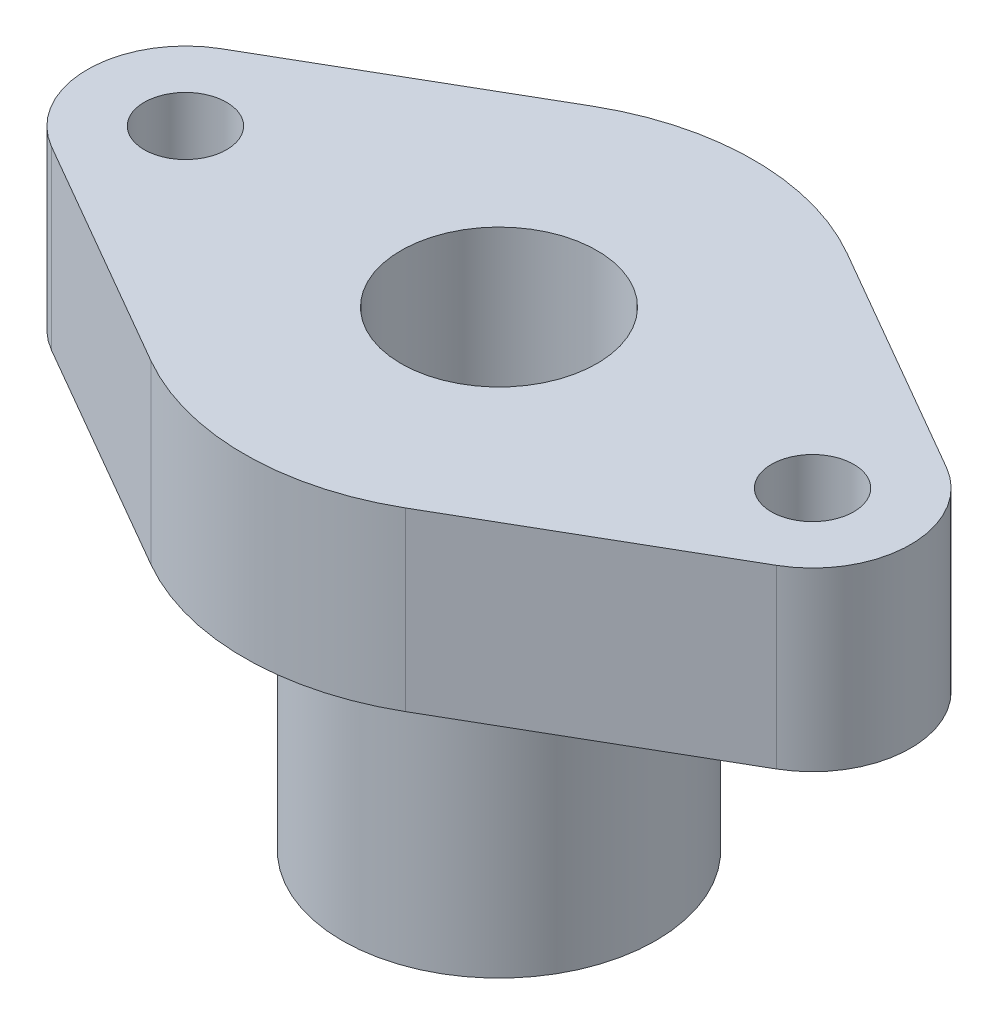
ISO-10303-21;
HEADER;
FILE_DESCRIPTION(('STEP AP214'),'2;1');
FILE_NAME('part.step','',(''),(''),'','','');
FILE_SCHEMA(('AUTOMOTIVE_DESIGN { 1 0 10303 214 1 1 1 1 }'));
ENDSEC;
DATA;
#1=APPLICATION_CONTEXT('core data for automotive mechanical design processes');
#2=APPLICATION_PROTOCOL_DEFINITION('international standard','automotive_design',2000,#1);
#3=PRODUCT_CONTEXT('',#1,'mechanical');
#4=PRODUCT('Part','Part','',(#3));
#5=PRODUCT_RELATED_PRODUCT_CATEGORY('part','',(#4));
#6=PRODUCT_DEFINITION_FORMATION('','',#4);
#7=PRODUCT_DEFINITION_CONTEXT('part definition',#1,'design');
#8=PRODUCT_DEFINITION('design','',#6,#7);
#9=PRODUCT_DEFINITION_SHAPE('','',#8);
#10=(LENGTH_UNIT() NAMED_UNIT(*) SI_UNIT(.MILLI.,.METRE.));
#11=(NAMED_UNIT(*) PLANE_ANGLE_UNIT() SI_UNIT($,.RADIAN.));
#12=(NAMED_UNIT(*) SI_UNIT($,.STERADIAN.) SOLID_ANGLE_UNIT());
#13=UNCERTAINTY_MEASURE_WITH_UNIT(LENGTH_MEASURE(1.E-05),#10,'distance_accuracy_value','');
#14=(GEOMETRIC_REPRESENTATION_CONTEXT(3) GLOBAL_UNCERTAINTY_ASSIGNED_CONTEXT((#13)) GLOBAL_UNIT_ASSIGNED_CONTEXT((#10,
#11,#12)) REPRESENTATION_CONTEXT('',''));
#15=CARTESIAN_POINT('',(0.,0.,0.));
#16=DIRECTION('',(0.,0.,1.));
#17=DIRECTION('',(1.,0.,0.));
#18=AXIS2_PLACEMENT_3D('',#15,#16,#17);
#19=CARTESIAN_POINT('',(0.,8.36734693877551,0.));
#20=DIRECTION('',(0.,1.,0.));
#21=DIRECTION('',(0.,0.,1.));
#22=AXIS2_PLACEMENT_3D('',#19,#20,#21);
#23=CYLINDRICAL_SURFACE('',#22,8.);
#24=CARTESIAN_POINT('',(0.,-11.6326530612245,0.));
#25=DIRECTION('',(0.,1.,0.));
#26=DIRECTION('',(0.,0.,1.));
#27=AXIS2_PLACEMENT_3D('',#24,#25,#26);
#28=CIRCLE('',#27,7.99999999999999);
#29=CARTESIAN_POINT('',(0.,-11.6326530612245,7.99999999999999));
#30=VERTEX_POINT('',#29);
#31=EDGE_CURVE('E43',#30,#30,#28,.T.);
#32=ORIENTED_EDGE('',*,*,#31,.T.);
#33=EDGE_LOOP('',(#32));
#34=FACE_BOUND('',#33,.T.);
#35=CARTESIAN_POINT('',(0.,3.36734693877551,0.));
#36=DIRECTION('',(0.,1.,0.));
#37=DIRECTION('',(0.,0.,1.));
#38=AXIS2_PLACEMENT_3D('',#35,#36,#37);
#39=CIRCLE('',#38,8.);
#40=CARTESIAN_POINT('',(0.,3.36734693877551,8.));
#41=VERTEX_POINT('',#40);
#42=EDGE_CURVE('E11',#41,#41,#39,.T.);
#43=ORIENTED_EDGE('',*,*,#42,.F.);
#44=EDGE_LOOP('',(#43));
#45=FACE_BOUND('',#44,.T.);
#46=ADVANCED_FACE('F34',(#34,#45),#23,.T.);
#47=CARTESIAN_POINT('',(-7.99999999999999,-11.6326530612245,0.));
#48=DIRECTION('',(0.,-1.,0.));
#49=DIRECTION('',(0.,0.,-1.));
#50=AXIS2_PLACEMENT_3D('',#47,#48,#49);
#51=PLANE('',#50);
#52=CARTESIAN_POINT('',(0.,-11.6326530612245,0.));
#53=DIRECTION('',(0.,1.,0.));
#54=DIRECTION('',(0.,0.,1.));
#55=AXIS2_PLACEMENT_3D('',#52,#53,#54);
#56=CIRCLE('',#55,5.);
#57=CARTESIAN_POINT('',(0.,-11.6326530612245,5.));
#58=VERTEX_POINT('',#57);
#59=EDGE_CURVE('E163',#58,#58,#56,.T.);
#60=ORIENTED_EDGE('',*,*,#59,.T.);
#61=EDGE_LOOP('',(#60));
#62=FACE_BOUND('',#61,.T.);
#63=ORIENTED_EDGE('',*,*,#31,.F.);
#64=EDGE_LOOP('',(#63));
#65=FACE_BOUND('',#64,.T.);
#66=ADVANCED_FACE('F171',(#62,#65),#51,.T.);
#67=CARTESIAN_POINT('',(0.,8.36734693877551,0.));
#68=DIRECTION('',(0.,1.,0.));
#69=DIRECTION('',(0.,0.,1.));
#70=AXIS2_PLACEMENT_3D('',#67,#68,#69);
#71=CYLINDRICAL_SURFACE('',#70,5.);
#72=ORIENTED_EDGE('',*,*,#59,.F.);
#73=EDGE_LOOP('',(#72));
#74=FACE_BOUND('',#73,.T.);
#75=CARTESIAN_POINT('',(0.,12.3673469387755,0.));
#76=DIRECTION('',(0.,1.,0.));
#77=DIRECTION('',(0.,0.,1.));
#78=AXIS2_PLACEMENT_3D('',#75,#76,#77);
#79=CIRCLE('',#78,5.);
#80=CARTESIAN_POINT('',(0.,12.3673469387755,5.));
#81=VERTEX_POINT('',#80);
#82=EDGE_CURVE('E137',#81,#81,#79,.T.);
#83=ORIENTED_EDGE('',*,*,#82,.T.);
#84=EDGE_LOOP('',(#83));
#85=FACE_BOUND('',#84,.T.);
#86=ADVANCED_FACE('F173',(#74,#85),#71,.F.);
#87=CARTESIAN_POINT('',(0.,12.3673469387755,0.));
#88=DIRECTION('',(0.,1.,0.));
#89=DIRECTION('',(0.,0.,1.));
#90=AXIS2_PLACEMENT_3D('',#87,#88,#89);
#91=PLANE('',#90);
#92=CARTESIAN_POINT('',(-16.,12.3673469387755,0.));
#93=DIRECTION('',(0.,1.,0.));
#94=DIRECTION('',(0.,0.,1.));
#95=AXIS2_PLACEMENT_3D('',#92,#93,#94);
#96=CIRCLE('',#95,2.1);
#97=CARTESIAN_POINT('',(-16.,12.3673469387755,2.1));
#98=VERTEX_POINT('',#97);
#99=EDGE_CURVE('E227',#98,#98,#96,.T.);
#100=ORIENTED_EDGE('',*,*,#99,.F.);
#101=EDGE_LOOP('',(#100));
#102=FACE_BOUND('',#101,.T.);
#103=CARTESIAN_POINT('',(16.,12.3673469387755,0.));
#104=DIRECTION('',(0.,1.,0.));
#105=DIRECTION('',(0.,0.,1.));
#106=AXIS2_PLACEMENT_3D('',#103,#104,#105);
#107=CIRCLE('',#106,2.1);
#108=CARTESIAN_POINT('',(16.,12.3673469387755,2.1));
#109=VERTEX_POINT('',#108);
#110=EDGE_CURVE('E230',#109,#109,#107,.T.);
#111=ORIENTED_EDGE('',*,*,#110,.F.);
#112=EDGE_LOOP('',(#111));
#113=FACE_BOUND('',#112,.T.);
#114=CARTESIAN_POINT('',(0.,12.3673469387755,0.));
#115=DIRECTION('',(0.,1.,0.));
#116=DIRECTION('',(0.,0.,1.));
#117=AXIS2_PLACEMENT_3D('',#114,#115,#116);
#118=CIRCLE('',#117,13.);
#119=CARTESIAN_POINT('',(6.5,12.3673469387755,-11.2583302491977));
#120=VERTEX_POINT('',#119);
#121=CARTESIAN_POINT('',(-6.5,12.3673469387755,-11.2583302491977));
#122=VERTEX_POINT('',#121);
#123=EDGE_CURVE('E148',#120,#122,#118,.T.);
#124=ORIENTED_EDGE('',*,*,#123,.T.);
#125=DIRECTION('',(-0.866025403784439,0.,0.5));
#126=VECTOR('',#125,1.);
#127=CARTESIAN_POINT('',(-6.5,12.3673469387755,-11.2583302491977));
#128=LINE('',#127,#126);
#129=CARTESIAN_POINT('',(-18.5,12.3673469387755,-4.33012701892219));
#130=VERTEX_POINT('',#129);
#131=EDGE_CURVE('E95',#122,#130,#128,.T.);
#132=ORIENTED_EDGE('',*,*,#131,.T.);
#133=CARTESIAN_POINT('',(-16.,12.3673469387755,0.));
#134=DIRECTION('',(0.,1.,0.));
#135=DIRECTION('',(0.,0.,1.));
#136=AXIS2_PLACEMENT_3D('',#133,#134,#135);
#137=CIRCLE('',#136,5.);
#138=CARTESIAN_POINT('',(-18.5,12.3673469387755,4.33012701892219));
#139=VERTEX_POINT('',#138);
#140=EDGE_CURVE('E242',#130,#139,#137,.T.);
#141=ORIENTED_EDGE('',*,*,#140,.T.);
#142=DIRECTION('',(0.866025403784439,0.,0.5));
#143=VECTOR('',#142,1.);
#144=CARTESIAN_POINT('',(-6.5,12.3673469387755,11.2583302491977));
#145=LINE('',#144,#143);
#146=CARTESIAN_POINT('',(-6.5,12.3673469387755,11.2583302491977));
#147=VERTEX_POINT('',#146);
#148=EDGE_CURVE('E244',#139,#147,#145,.T.);
#149=ORIENTED_EDGE('',*,*,#148,.T.);
#150=CARTESIAN_POINT('',(0.,12.3673469387755,0.));
#151=DIRECTION('',(0.,1.,0.));
#152=DIRECTION('',(0.,0.,1.));
#153=AXIS2_PLACEMENT_3D('',#150,#151,#152);
#154=CIRCLE('',#153,13.);
#155=CARTESIAN_POINT('',(6.5,12.3673469387755,11.2583302491977));
#156=VERTEX_POINT('',#155);
#157=EDGE_CURVE('E115',#147,#156,#154,.T.);
#158=ORIENTED_EDGE('',*,*,#157,.T.);
#159=DIRECTION('',(0.866025403784438,0.,-0.5));
#160=VECTOR('',#159,1.);
#161=CARTESIAN_POINT('',(6.5,12.3673469387755,11.2583302491977));
#162=LINE('',#161,#160);
#163=CARTESIAN_POINT('',(18.5,12.3673469387755,4.33012701892219));
#164=VERTEX_POINT('',#163);
#165=EDGE_CURVE('E108',#156,#164,#162,.T.);
#166=ORIENTED_EDGE('',*,*,#165,.T.);
#167=CARTESIAN_POINT('',(16.,12.3673469387755,0.));
#168=DIRECTION('',(0.,1.,0.));
#169=DIRECTION('',(0.,0.,1.));
#170=AXIS2_PLACEMENT_3D('',#167,#168,#169);
#171=CIRCLE('',#170,5.);
#172=CARTESIAN_POINT('',(18.5,12.3673469387755,-4.33012701892219));
#173=VERTEX_POINT('',#172);
#174=EDGE_CURVE('E113',#164,#173,#171,.T.);
#175=ORIENTED_EDGE('',*,*,#174,.T.);
#176=DIRECTION('',(-0.866025403784439,0.,-0.5));
#177=VECTOR('',#176,1.);
#178=CARTESIAN_POINT('',(6.5,12.3673469387755,-11.2583302491977));
#179=LINE('',#178,#177);
#180=EDGE_CURVE('E51',#173,#120,#179,.T.);
#181=ORIENTED_EDGE('',*,*,#180,.T.);
#182=EDGE_LOOP('',(#124,#132,#141,#149,#158,#166,#175,#181));
#183=FACE_BOUND('',#182,.T.);
#184=ORIENTED_EDGE('',*,*,#82,.F.);
#185=EDGE_LOOP('',(#184));
#186=FACE_BOUND('',#185,.T.);
#187=ADVANCED_FACE('F110',(#102,#113,#183,#186),#91,.T.);
#188=CARTESIAN_POINT('',(0.,3.36734693877551,0.));
#189=DIRECTION('',(0.,1.,0.));
#190=DIRECTION('',(0.,0.,1.));
#191=AXIS2_PLACEMENT_3D('',#188,#189,#190);
#192=PLANE('',#191);
#193=CARTESIAN_POINT('',(-16.,3.36734693877551,0.));
#194=DIRECTION('',(0.,1.,0.));
#195=DIRECTION('',(0.,0.,1.));
#196=AXIS2_PLACEMENT_3D('',#193,#194,#195);
#197=CIRCLE('',#196,2.1);
#198=CARTESIAN_POINT('',(-16.,3.36734693877551,2.1));
#199=VERTEX_POINT('',#198);
#200=EDGE_CURVE('E37',#199,#199,#197,.T.);
#201=ORIENTED_EDGE('',*,*,#200,.T.);
#202=EDGE_LOOP('',(#201));
#203=FACE_BOUND('',#202,.T.);
#204=CARTESIAN_POINT('',(16.,3.36734693877551,0.));
#205=DIRECTION('',(0.,1.,0.));
#206=DIRECTION('',(0.,0.,1.));
#207=AXIS2_PLACEMENT_3D('',#204,#205,#206);
#208=CIRCLE('',#207,2.1);
#209=CARTESIAN_POINT('',(16.,3.36734693877551,2.1));
#210=VERTEX_POINT('',#209);
#211=EDGE_CURVE('E232',#210,#210,#208,.T.);
#212=ORIENTED_EDGE('',*,*,#211,.T.);
#213=EDGE_LOOP('',(#212));
#214=FACE_BOUND('',#213,.T.);
#215=ORIENTED_EDGE('',*,*,#42,.T.);
#216=EDGE_LOOP('',(#215));
#217=FACE_BOUND('',#216,.T.);
#218=CARTESIAN_POINT('',(0.,3.36734693877551,0.));
#219=DIRECTION('',(0.,1.,0.));
#220=DIRECTION('',(0.,0.,1.));
#221=AXIS2_PLACEMENT_3D('',#218,#219,#220);
#222=CIRCLE('',#221,13.);
#223=CARTESIAN_POINT('',(6.5,3.36734693877551,-11.2583302491977));
#224=VERTEX_POINT('',#223);
#225=CARTESIAN_POINT('',(-6.5,3.36734693877551,-11.2583302491977));
#226=VERTEX_POINT('',#225);
#227=EDGE_CURVE('E133',#224,#226,#222,.T.);
#228=ORIENTED_EDGE('',*,*,#227,.F.);
#229=DIRECTION('',(-0.866025403784439,0.,-0.5));
#230=VECTOR('',#229,1.);
#231=CARTESIAN_POINT('',(6.5,3.36734693877551,-11.2583302491977));
#232=LINE('',#231,#230);
#233=CARTESIAN_POINT('',(18.5,3.36734693877551,-4.33012701892219));
#234=VERTEX_POINT('',#233);
#235=EDGE_CURVE('E86',#234,#224,#232,.T.);
#236=ORIENTED_EDGE('',*,*,#235,.F.);
#237=CARTESIAN_POINT('',(16.,3.36734693877551,0.));
#238=DIRECTION('',(0.,1.,0.));
#239=DIRECTION('',(0.,0.,1.));
#240=AXIS2_PLACEMENT_3D('',#237,#238,#239);
#241=CIRCLE('',#240,5.);
#242=CARTESIAN_POINT('',(18.5,3.36734693877551,4.33012701892219));
#243=VERTEX_POINT('',#242);
#244=EDGE_CURVE('E80',#243,#234,#241,.T.);
#245=ORIENTED_EDGE('',*,*,#244,.F.);
#246=DIRECTION('',(0.866025403784438,0.,-0.5));
#247=VECTOR('',#246,1.);
#248=CARTESIAN_POINT('',(6.5,3.36734693877551,11.2583302491977));
#249=LINE('',#248,#247);
#250=CARTESIAN_POINT('',(6.5,3.36734693877551,11.2583302491977));
#251=VERTEX_POINT('',#250);
#252=EDGE_CURVE('E123',#251,#243,#249,.T.);
#253=ORIENTED_EDGE('',*,*,#252,.F.);
#254=CARTESIAN_POINT('',(0.,3.36734693877551,0.));
#255=DIRECTION('',(0.,1.,0.));
#256=DIRECTION('',(0.,0.,1.));
#257=AXIS2_PLACEMENT_3D('',#254,#255,#256);
#258=CIRCLE('',#257,13.);
#259=CARTESIAN_POINT('',(-6.5,3.36734693877551,11.2583302491977));
#260=VERTEX_POINT('',#259);
#261=EDGE_CURVE('E143',#260,#251,#258,.T.);
#262=ORIENTED_EDGE('',*,*,#261,.F.);
#263=DIRECTION('',(0.866025403784439,0.,0.5));
#264=VECTOR('',#263,1.);
#265=CARTESIAN_POINT('',(-6.5,3.36734693877551,11.2583302491977));
#266=LINE('',#265,#264);
#267=CARTESIAN_POINT('',(-18.5,3.36734693877551,4.33012701892219));
#268=VERTEX_POINT('',#267);
#269=EDGE_CURVE('E141',#268,#260,#266,.T.);
#270=ORIENTED_EDGE('',*,*,#269,.F.);
#271=CARTESIAN_POINT('',(-16.,3.36734693877551,0.));
#272=DIRECTION('',(0.,1.,0.));
#273=DIRECTION('',(0.,0.,1.));
#274=AXIS2_PLACEMENT_3D('',#271,#272,#273);
#275=CIRCLE('',#274,5.);
#276=CARTESIAN_POINT('',(-18.5,3.36734693877551,-4.33012701892219));
#277=VERTEX_POINT('',#276);
#278=EDGE_CURVE('E139',#277,#268,#275,.T.);
#279=ORIENTED_EDGE('',*,*,#278,.F.);
#280=DIRECTION('',(-0.866025403784439,0.,0.5));
#281=VECTOR('',#280,1.);
#282=CARTESIAN_POINT('',(-6.5,3.36734693877551,-11.2583302491977));
#283=LINE('',#282,#281);
#284=EDGE_CURVE('E136',#226,#277,#283,.T.);
#285=ORIENTED_EDGE('',*,*,#284,.F.);
#286=EDGE_LOOP('',(#228,#236,#245,#253,#262,#270,#279,#285));
#287=FACE_BOUND('',#286,.T.);
#288=ADVANCED_FACE('F186',(#203,#214,#217,#287),#192,.F.);
#289=CARTESIAN_POINT('',(0.,12.3673469387755,0.));
#290=DIRECTION('',(0.,-1.,0.));
#291=DIRECTION('',(0.,0.,-1.));
#292=AXIS2_PLACEMENT_3D('',#289,#290,#291);
#293=CYLINDRICAL_SURFACE('',#292,13.);
#294=ORIENTED_EDGE('',*,*,#227,.T.);
#295=DIRECTION('',(0.,-1.,0.));
#296=VECTOR('',#295,1.);
#297=CARTESIAN_POINT('',(-6.5,12.3673469387755,-11.2583302491977));
#298=LINE('',#297,#296);
#299=EDGE_CURVE('E161',#122,#226,#298,.T.);
#300=ORIENTED_EDGE('',*,*,#299,.F.);
#301=ORIENTED_EDGE('',*,*,#123,.F.);
#302=DIRECTION('',(0.,-1.,0.));
#303=VECTOR('',#302,1.);
#304=CARTESIAN_POINT('',(6.5,12.3673469387755,-11.2583302491977));
#305=LINE('',#304,#303);
#306=EDGE_CURVE('E129',#120,#224,#305,.T.);
#307=ORIENTED_EDGE('',*,*,#306,.T.);
#308=EDGE_LOOP('',(#294,#300,#301,#307));
#309=FACE_BOUND('',#308,.T.);
#310=ADVANCED_FACE('F182',(#309),#293,.T.);
#311=CARTESIAN_POINT('',(-6.5,12.3673469387755,-11.2583302491977));
#312=DIRECTION('',(0.5,0.,0.866025403784439));
#313=DIRECTION('',(0.866025403784439,0.,-0.5));
#314=AXIS2_PLACEMENT_3D('',#311,#312,#313);
#315=PLANE('',#314);
#316=ORIENTED_EDGE('',*,*,#284,.T.);
#317=DIRECTION('',(0.,-1.,0.));
#318=VECTOR('',#317,1.);
#319=CARTESIAN_POINT('',(-18.5,12.3673469387755,-4.33012701892219));
#320=LINE('',#319,#318);
#321=EDGE_CURVE('E158',#130,#277,#320,.T.);
#322=ORIENTED_EDGE('',*,*,#321,.F.);
#323=ORIENTED_EDGE('',*,*,#131,.F.);
#324=ORIENTED_EDGE('',*,*,#299,.T.);
#325=EDGE_LOOP('',(#316,#322,#323,#324));
#326=FACE_BOUND('',#325,.T.);
#327=ADVANCED_FACE('F185',(#326),#315,.F.);
#328=CARTESIAN_POINT('',(-16.,12.3673469387755,0.));
#329=DIRECTION('',(0.,-1.,0.));
#330=DIRECTION('',(0.,0.,-1.));
#331=AXIS2_PLACEMENT_3D('',#328,#329,#330);
#332=CYLINDRICAL_SURFACE('',#331,5.);
#333=ORIENTED_EDGE('',*,*,#278,.T.);
#334=DIRECTION('',(0.,-1.,0.));
#335=VECTOR('',#334,1.);
#336=CARTESIAN_POINT('',(-18.5,12.3673469387755,4.33012701892219));
#337=LINE('',#336,#335);
#338=EDGE_CURVE('E155',#139,#268,#337,.T.);
#339=ORIENTED_EDGE('',*,*,#338,.F.);
#340=ORIENTED_EDGE('',*,*,#140,.F.);
#341=ORIENTED_EDGE('',*,*,#321,.T.);
#342=EDGE_LOOP('',(#333,#339,#340,#341));
#343=FACE_BOUND('',#342,.T.);
#344=ADVANCED_FACE('F190',(#343),#332,.T.);
#345=CARTESIAN_POINT('',(-6.5,12.3673469387755,11.2583302491977));
#346=DIRECTION('',(0.5,0.,-0.866025403784439));
#347=DIRECTION('',(-0.866025403784439,0.,-0.5));
#348=AXIS2_PLACEMENT_3D('',#345,#346,#347);
#349=PLANE('',#348);
#350=ORIENTED_EDGE('',*,*,#269,.T.);
#351=DIRECTION('',(0.,-1.,0.));
#352=VECTOR('',#351,1.);
#353=CARTESIAN_POINT('',(-6.5,12.3673469387755,11.2583302491977));
#354=LINE('',#353,#352);
#355=EDGE_CURVE('E152',#147,#260,#354,.T.);
#356=ORIENTED_EDGE('',*,*,#355,.F.);
#357=ORIENTED_EDGE('',*,*,#148,.F.);
#358=ORIENTED_EDGE('',*,*,#338,.T.);
#359=EDGE_LOOP('',(#350,#356,#357,#358));
#360=FACE_BOUND('',#359,.T.);
#361=ADVANCED_FACE('F193',(#360),#349,.F.);
#362=CARTESIAN_POINT('',(0.,12.3673469387755,0.));
#363=DIRECTION('',(0.,-1.,0.));
#364=DIRECTION('',(0.,0.,-1.));
#365=AXIS2_PLACEMENT_3D('',#362,#363,#364);
#366=CYLINDRICAL_SURFACE('',#365,13.);
#367=ORIENTED_EDGE('',*,*,#261,.T.);
#368=DIRECTION('',(0.,-1.,0.));
#369=VECTOR('',#368,1.);
#370=CARTESIAN_POINT('',(6.5,12.3673469387755,11.2583302491977));
#371=LINE('',#370,#369);
#372=EDGE_CURVE('E124',#156,#251,#371,.T.);
#373=ORIENTED_EDGE('',*,*,#372,.F.);
#374=ORIENTED_EDGE('',*,*,#157,.F.);
#375=ORIENTED_EDGE('',*,*,#355,.T.);
#376=EDGE_LOOP('',(#367,#373,#374,#375));
#377=FACE_BOUND('',#376,.T.);
#378=ADVANCED_FACE('F197',(#377),#366,.T.);
#379=CARTESIAN_POINT('',(6.5,12.3673469387755,11.2583302491977));
#380=DIRECTION('',(-0.5,0.,-0.866025403784438));
#381=DIRECTION('',(-0.866025403784439,0.,0.5));
#382=AXIS2_PLACEMENT_3D('',#379,#380,#381);
#383=PLANE('',#382);
#384=ORIENTED_EDGE('',*,*,#252,.T.);
#385=DIRECTION('',(0.,-1.,0.));
#386=VECTOR('',#385,1.);
#387=CARTESIAN_POINT('',(18.5,12.3673469387755,4.33012701892219));
#388=LINE('',#387,#386);
#389=EDGE_CURVE('E120',#164,#243,#388,.T.);
#390=ORIENTED_EDGE('',*,*,#389,.F.);
#391=ORIENTED_EDGE('',*,*,#165,.F.);
#392=ORIENTED_EDGE('',*,*,#372,.T.);
#393=EDGE_LOOP('',(#384,#390,#391,#392));
#394=FACE_BOUND('',#393,.T.);
#395=ADVANCED_FACE('F121',(#394),#383,.F.);
#396=CARTESIAN_POINT('',(16.,12.3673469387755,0.));
#397=DIRECTION('',(0.,-1.,0.));
#398=DIRECTION('',(0.,0.,-1.));
#399=AXIS2_PLACEMENT_3D('',#396,#397,#398);
#400=CYLINDRICAL_SURFACE('',#399,5.);
#401=ORIENTED_EDGE('',*,*,#244,.T.);
#402=DIRECTION('',(0.,-1.,0.));
#403=VECTOR('',#402,1.);
#404=CARTESIAN_POINT('',(18.5,12.3673469387755,-4.33012701892219));
#405=LINE('',#404,#403);
#406=EDGE_CURVE('E125',#173,#234,#405,.T.);
#407=ORIENTED_EDGE('',*,*,#406,.F.);
#408=ORIENTED_EDGE('',*,*,#174,.F.);
#409=ORIENTED_EDGE('',*,*,#389,.T.);
#410=EDGE_LOOP('',(#401,#407,#408,#409));
#411=FACE_BOUND('',#410,.T.);
#412=ADVANCED_FACE('F127',(#411),#400,.T.);
#413=CARTESIAN_POINT('',(6.5,12.3673469387755,-11.2583302491977));
#414=DIRECTION('',(-0.5,0.,0.866025403784439));
#415=DIRECTION('',(0.866025403784439,0.,0.5));
#416=AXIS2_PLACEMENT_3D('',#413,#414,#415);
#417=PLANE('',#416);
#418=ORIENTED_EDGE('',*,*,#235,.T.);
#419=ORIENTED_EDGE('',*,*,#306,.F.);
#420=ORIENTED_EDGE('',*,*,#180,.F.);
#421=ORIENTED_EDGE('',*,*,#406,.T.);
#422=EDGE_LOOP('',(#418,#419,#420,#421));
#423=FACE_BOUND('',#422,.T.);
#424=ADVANCED_FACE('F206',(#423),#417,.F.);
#425=CARTESIAN_POINT('',(16.,12.3673469387755,0.));
#426=DIRECTION('',(0.,1.,0.));
#427=DIRECTION('',(0.,0.,1.));
#428=AXIS2_PLACEMENT_3D('',#425,#426,#427);
#429=CYLINDRICAL_SURFACE('',#428,2.1);
#430=ORIENTED_EDGE('',*,*,#110,.T.);
#431=EDGE_LOOP('',(#430));
#432=FACE_BOUND('',#431,.T.);
#433=ORIENTED_EDGE('',*,*,#211,.F.);
#434=EDGE_LOOP('',(#433));
#435=FACE_BOUND('',#434,.T.);
#436=ADVANCED_FACE('F209',(#432,#435),#429,.F.);
#437=CARTESIAN_POINT('',(-16.,12.3673469387755,0.));
#438=DIRECTION('',(0.,1.,0.));
#439=DIRECTION('',(0.,0.,1.));
#440=AXIS2_PLACEMENT_3D('',#437,#438,#439);
#441=CYLINDRICAL_SURFACE('',#440,2.1);
#442=ORIENTED_EDGE('',*,*,#99,.T.);
#443=EDGE_LOOP('',(#442));
#444=FACE_BOUND('',#443,.T.);
#445=ORIENTED_EDGE('',*,*,#200,.F.);
#446=EDGE_LOOP('',(#445));
#447=FACE_BOUND('',#446,.T.);
#448=ADVANCED_FACE('F218',(#444,#447),#441,.F.);
#449=CLOSED_SHELL('',(#46,#66,#86,#187,#288,#310,#327,#344,#361,#378,#395,#412,#424,#436,#448));
#450=MANIFOLD_SOLID_BREP('B2',#449);
#451=ADVANCED_BREP_SHAPE_REPRESENTATION('',(#18,#450),#14);
#452=SHAPE_DEFINITION_REPRESENTATION(#9,#451);
ENDSEC;
END-ISO-10303-21;
